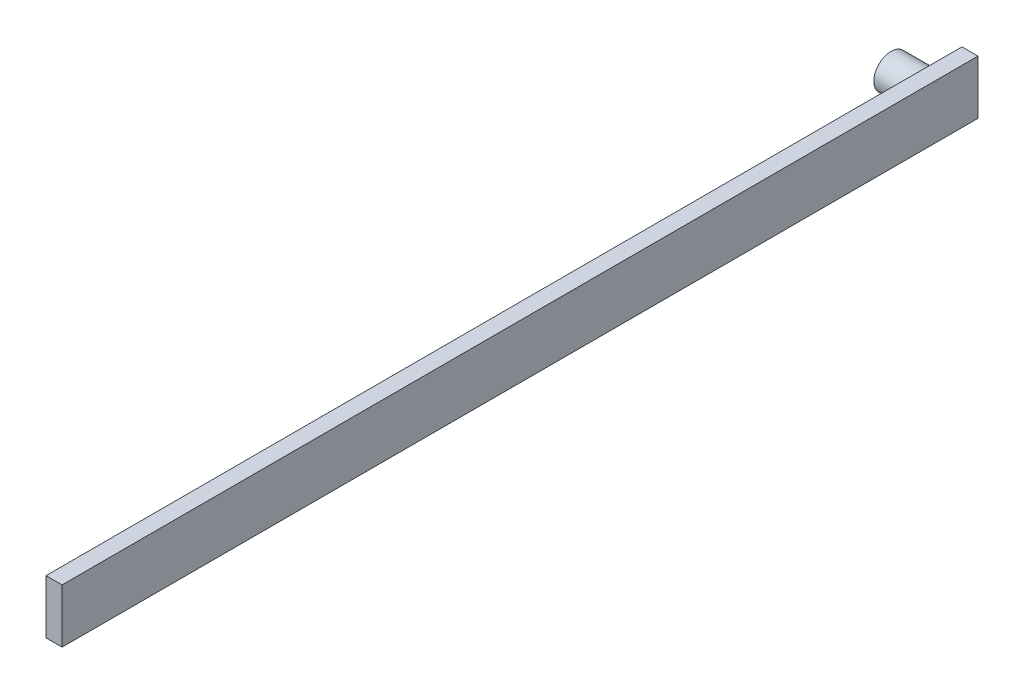
ISO-10303-21;
HEADER;
FILE_DESCRIPTION(('STEP AP214'),'2;1');
FILE_NAME('part.step','',(''),(''),'','','');
FILE_SCHEMA(('AUTOMOTIVE_DESIGN { 1 0 10303 214 1 1 1 1 }'));
ENDSEC;
DATA;
#1=APPLICATION_CONTEXT('core data for automotive mechanical design processes');
#2=APPLICATION_PROTOCOL_DEFINITION('international standard','automotive_design',2000,#1);
#3=PRODUCT_CONTEXT('',#1,'mechanical');
#4=PRODUCT('Part','Part','',(#3));
#5=PRODUCT_RELATED_PRODUCT_CATEGORY('part','',(#4));
#6=PRODUCT_DEFINITION_FORMATION('','',#4);
#7=PRODUCT_DEFINITION_CONTEXT('part definition',#1,'design');
#8=PRODUCT_DEFINITION('design','',#6,#7);
#9=PRODUCT_DEFINITION_SHAPE('','',#8);
#10=(LENGTH_UNIT() NAMED_UNIT(*) SI_UNIT(.MILLI.,.METRE.));
#11=(NAMED_UNIT(*) PLANE_ANGLE_UNIT() SI_UNIT($,.RADIAN.));
#12=(NAMED_UNIT(*) SI_UNIT($,.STERADIAN.) SOLID_ANGLE_UNIT());
#13=UNCERTAINTY_MEASURE_WITH_UNIT(LENGTH_MEASURE(1.E-05),#10,'distance_accuracy_value','');
#14=(GEOMETRIC_REPRESENTATION_CONTEXT(3) GLOBAL_UNCERTAINTY_ASSIGNED_CONTEXT((#13)) GLOBAL_UNIT_ASSIGNED_CONTEXT((#10,
#11,#12)) REPRESENTATION_CONTEXT('',''));
#15=CARTESIAN_POINT('',(0.,0.,0.));
#16=DIRECTION('',(0.,0.,1.));
#17=DIRECTION('',(1.,0.,0.));
#18=AXIS2_PLACEMENT_3D('',#15,#16,#17);
#19=CARTESIAN_POINT('',(18.,0.,0.));
#20=DIRECTION('',(-1.,0.,0.));
#21=DIRECTION('',(0.,0.,1.));
#22=AXIS2_PLACEMENT_3D('',#19,#20,#21);
#23=CYLINDRICAL_SURFACE('',#22,7.5);
#24=CARTESIAN_POINT('',(18.,0.,0.));
#25=DIRECTION('',(1.,0.,0.));
#26=DIRECTION('',(0.,0.,-1.));
#27=AXIS2_PLACEMENT_3D('',#24,#25,#26);
#28=CIRCLE('',#27,7.5);
#29=CARTESIAN_POINT('',(18.,0.,-7.5));
#30=VERTEX_POINT('',#29);
#31=EDGE_CURVE('E11',#30,#30,#28,.T.);
#32=ORIENTED_EDGE('',*,*,#31,.F.);
#33=EDGE_LOOP('',(#32));
#34=FACE_BOUND('',#33,.T.);
#35=CARTESIAN_POINT('',(0.,0.,0.));
#36=DIRECTION('',(1.,0.,0.));
#37=DIRECTION('',(0.,0.,-1.));
#38=AXIS2_PLACEMENT_3D('',#35,#36,#37);
#39=CIRCLE('',#38,7.5);
#40=CARTESIAN_POINT('',(0.,0.,-7.5));
#41=VERTEX_POINT('',#40);
#42=EDGE_CURVE('E48',#41,#41,#39,.T.);
#43=ORIENTED_EDGE('',*,*,#42,.T.);
#44=EDGE_LOOP('',(#43));
#45=FACE_BOUND('',#44,.T.);
#46=ADVANCED_FACE('F45',(#34,#45),#23,.T.);
#47=CARTESIAN_POINT('',(0.,0.,0.));
#48=DIRECTION('',(1.,0.,0.));
#49=DIRECTION('',(0.,0.,-1.));
#50=AXIS2_PLACEMENT_3D('',#47,#48,#49);
#51=PLANE('',#50);
#52=ORIENTED_EDGE('',*,*,#42,.F.);
#53=EDGE_LOOP('',(#52));
#54=FACE_BOUND('',#53,.T.);
#55=ADVANCED_FACE('F137',(#54),#51,.F.);
#56=CARTESIAN_POINT('',(25.,-11.7588796100375,386.58773458835));
#57=DIRECTION('',(0.,1.,0.));
#58=DIRECTION('',(0.,0.,1.));
#59=AXIS2_PLACEMENT_3D('',#56,#57,#58);
#60=PLANE('',#59);
#61=DIRECTION('',(0.,0.,-1.));
#62=VECTOR('',#61,1.);
#63=CARTESIAN_POINT('',(18.,-11.7588796100375,386.58773458835));
#64=LINE('',#63,#62);
#65=CARTESIAN_POINT('',(18.,-11.7588796100375,386.58773458835));
#66=VERTEX_POINT('',#65);
#67=CARTESIAN_POINT('',(18.,-11.7588796100375,-12.9555066639024));
#68=VERTEX_POINT('',#67);
#69=EDGE_CURVE('E117',#66,#68,#64,.T.);
#70=ORIENTED_EDGE('',*,*,#69,.T.);
#71=DIRECTION('',(-1.,0.,0.));
#72=VECTOR('',#71,1.);
#73=CARTESIAN_POINT('',(25.,-11.7588796100375,-12.9555066639024));
#74=LINE('',#73,#72);
#75=CARTESIAN_POINT('',(25.,-11.7588796100375,-12.9555066639024));
#76=VERTEX_POINT('',#75);
#77=EDGE_CURVE('E106',#76,#68,#74,.T.);
#78=ORIENTED_EDGE('',*,*,#77,.F.);
#79=DIRECTION('',(0.,0.,-1.));
#80=VECTOR('',#79,1.);
#81=CARTESIAN_POINT('',(25.,-11.7588796100375,386.58773458835));
#82=LINE('',#81,#80);
#83=CARTESIAN_POINT('',(25.,-11.7588796100375,386.58773458835));
#84=VERTEX_POINT('',#83);
#85=EDGE_CURVE('E98',#84,#76,#82,.T.);
#86=ORIENTED_EDGE('',*,*,#85,.F.);
#87=DIRECTION('',(-1.,0.,0.));
#88=VECTOR('',#87,1.);
#89=CARTESIAN_POINT('',(25.,-11.7588796100375,386.58773458835));
#90=LINE('',#89,#88);
#91=EDGE_CURVE('E113',#84,#66,#90,.T.);
#92=ORIENTED_EDGE('',*,*,#91,.T.);
#93=EDGE_LOOP('',(#70,#78,#86,#92));
#94=FACE_BOUND('',#93,.T.);
#95=ADVANCED_FACE('F139',(#94),#60,.F.);
#96=CARTESIAN_POINT('',(25.,11.7588796100375,-12.9555066639024));
#97=DIRECTION('',(0.,0.,1.));
#98=DIRECTION('',(1.,0.,0.));
#99=AXIS2_PLACEMENT_3D('',#96,#97,#98);
#100=PLANE('',#99);
#101=DIRECTION('',(0.,1.,0.));
#102=VECTOR('',#101,1.);
#103=CARTESIAN_POINT('',(18.,11.7588796100375,-12.9555066639024));
#104=LINE('',#103,#102);
#105=CARTESIAN_POINT('',(18.,11.7588796100375,-12.9555066639024));
#106=VERTEX_POINT('',#105);
#107=EDGE_CURVE('E104',#68,#106,#104,.T.);
#108=ORIENTED_EDGE('',*,*,#107,.T.);
#109=DIRECTION('',(-1.,0.,0.));
#110=VECTOR('',#109,1.);
#111=CARTESIAN_POINT('',(25.,11.7588796100375,-12.9555066639024));
#112=LINE('',#111,#110);
#113=CARTESIAN_POINT('',(25.,11.7588796100375,-12.9555066639024));
#114=VERTEX_POINT('',#113);
#115=EDGE_CURVE('E102',#114,#106,#112,.T.);
#116=ORIENTED_EDGE('',*,*,#115,.F.);
#117=DIRECTION('',(0.,1.,0.));
#118=VECTOR('',#117,1.);
#119=CARTESIAN_POINT('',(25.,11.7588796100375,-12.9555066639024));
#120=LINE('',#119,#118);
#121=EDGE_CURVE('E93',#76,#114,#120,.T.);
#122=ORIENTED_EDGE('',*,*,#121,.F.);
#123=ORIENTED_EDGE('',*,*,#77,.T.);
#124=EDGE_LOOP('',(#108,#116,#122,#123));
#125=FACE_BOUND('',#124,.T.);
#126=ADVANCED_FACE('F103',(#125),#100,.F.);
#127=CARTESIAN_POINT('',(25.,11.7588796100375,-12.9555066639024));
#128=DIRECTION('',(0.,-1.,0.));
#129=DIRECTION('',(0.,0.,-1.));
#130=AXIS2_PLACEMENT_3D('',#127,#128,#129);
#131=PLANE('',#130);
#132=DIRECTION('',(0.,0.,1.));
#133=VECTOR('',#132,1.);
#134=CARTESIAN_POINT('',(18.,11.7588796100375,-12.9555066639024));
#135=LINE('',#134,#133);
#136=CARTESIAN_POINT('',(18.,11.7588796100375,386.58773458835));
#137=VERTEX_POINT('',#136);
#138=EDGE_CURVE('E79',#106,#137,#135,.T.);
#139=ORIENTED_EDGE('',*,*,#138,.T.);
#140=DIRECTION('',(-1.,0.,0.));
#141=VECTOR('',#140,1.);
#142=CARTESIAN_POINT('',(25.,11.7588796100375,386.58773458835));
#143=LINE('',#142,#141);
#144=CARTESIAN_POINT('',(25.,11.7588796100375,386.58773458835));
#145=VERTEX_POINT('',#144);
#146=EDGE_CURVE('E107',#145,#137,#143,.T.);
#147=ORIENTED_EDGE('',*,*,#146,.F.);
#148=DIRECTION('',(0.,0.,1.));
#149=VECTOR('',#148,1.);
#150=CARTESIAN_POINT('',(25.,11.7588796100375,-12.9555066639024));
#151=LINE('',#150,#149);
#152=EDGE_CURVE('E96',#114,#145,#151,.T.);
#153=ORIENTED_EDGE('',*,*,#152,.F.);
#154=ORIENTED_EDGE('',*,*,#115,.T.);
#155=EDGE_LOOP('',(#139,#147,#153,#154));
#156=FACE_BOUND('',#155,.T.);
#157=ADVANCED_FACE('F109',(#156),#131,.F.);
#158=CARTESIAN_POINT('',(25.,11.7588796100375,386.58773458835));
#159=DIRECTION('',(0.,0.,-1.));
#160=DIRECTION('',(-1.,0.,0.));
#161=AXIS2_PLACEMENT_3D('',#158,#159,#160);
#162=PLANE('',#161);
#163=DIRECTION('',(0.,-1.,0.));
#164=VECTOR('',#163,1.);
#165=CARTESIAN_POINT('',(18.,11.7588796100375,386.58773458835));
#166=LINE('',#165,#164);
#167=EDGE_CURVE('E85',#137,#66,#166,.T.);
#168=ORIENTED_EDGE('',*,*,#167,.T.);
#169=ORIENTED_EDGE('',*,*,#91,.F.);
#170=DIRECTION('',(0.,-1.,0.));
#171=VECTOR('',#170,1.);
#172=CARTESIAN_POINT('',(25.,11.7588796100375,386.58773458835));
#173=LINE('',#172,#171);
#174=EDGE_CURVE('E62',#145,#84,#173,.T.);
#175=ORIENTED_EDGE('',*,*,#174,.F.);
#176=ORIENTED_EDGE('',*,*,#146,.T.);
#177=EDGE_LOOP('',(#168,#169,#175,#176));
#178=FACE_BOUND('',#177,.T.);
#179=ADVANCED_FACE('F152',(#178),#162,.F.);
#180=CARTESIAN_POINT('',(25.,0.,0.));
#181=DIRECTION('',(-1.,0.,0.));
#182=DIRECTION('',(0.,0.,1.));
#183=AXIS2_PLACEMENT_3D('',#180,#181,#182);
#184=PLANE('',#183);
#185=ORIENTED_EDGE('',*,*,#85,.T.);
#186=ORIENTED_EDGE('',*,*,#121,.T.);
#187=ORIENTED_EDGE('',*,*,#152,.T.);
#188=ORIENTED_EDGE('',*,*,#174,.T.);
#189=EDGE_LOOP('',(#185,#186,#187,#188));
#190=FACE_BOUND('',#189,.T.);
#191=ADVANCED_FACE('F94',(#190),#184,.F.);
#192=CARTESIAN_POINT('',(18.,0.,0.));
#193=DIRECTION('',(-1.,0.,0.));
#194=DIRECTION('',(0.,0.,1.));
#195=AXIS2_PLACEMENT_3D('',#192,#193,#194);
#196=PLANE('',#195);
#197=ORIENTED_EDGE('',*,*,#31,.T.);
#198=EDGE_LOOP('',(#197));
#199=FACE_BOUND('',#198,.T.);
#200=ORIENTED_EDGE('',*,*,#69,.F.);
#201=ORIENTED_EDGE('',*,*,#167,.F.);
#202=ORIENTED_EDGE('',*,*,#138,.F.);
#203=ORIENTED_EDGE('',*,*,#107,.F.);
#204=EDGE_LOOP('',(#200,#201,#202,#203));
#205=FACE_BOUND('',#204,.T.);
#206=ADVANCED_FACE('F155',(#199,#205),#196,.T.);
#207=CLOSED_SHELL('',(#46,#55,#95,#126,#157,#179,#191,#206));
#208=MANIFOLD_SOLID_BREP('B2',#207);
#209=ADVANCED_BREP_SHAPE_REPRESENTATION('',(#18,#208),#14);
#210=SHAPE_DEFINITION_REPRESENTATION(#9,#209);
ENDSEC;
END-ISO-10303-21;
